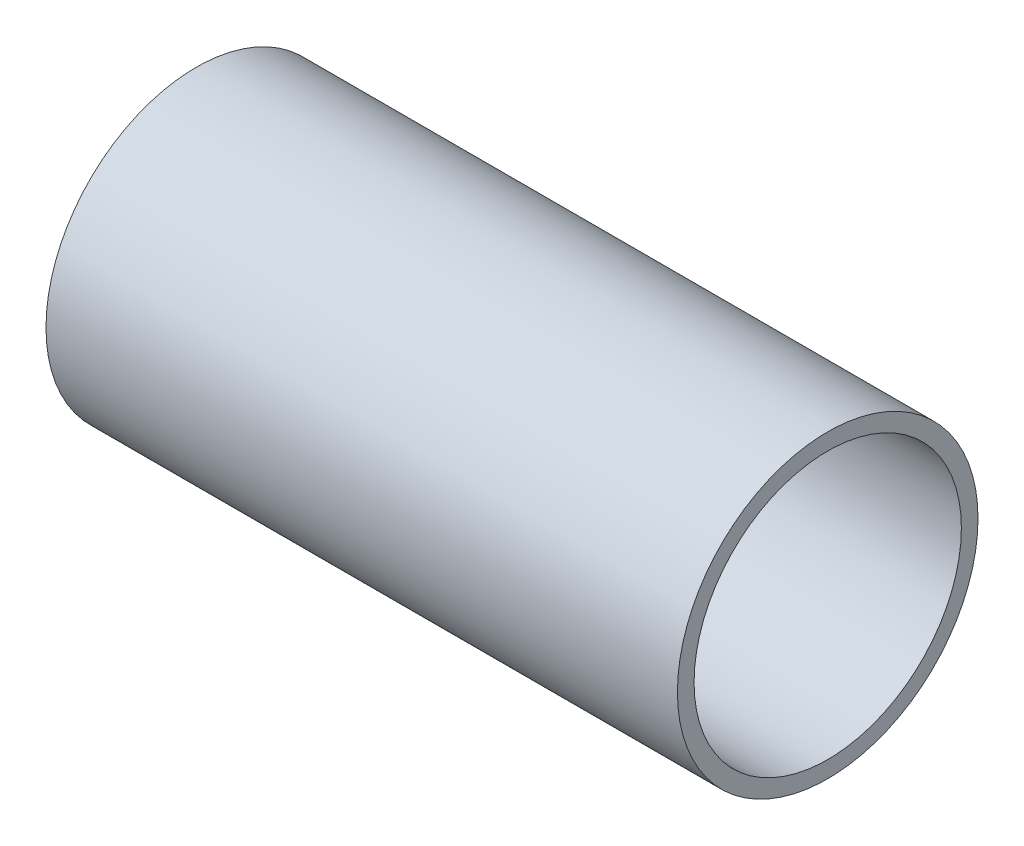
ISO-10303-21;
HEADER;
FILE_DESCRIPTION(('STEP AP214'),'2;1');
FILE_NAME('part.step','',(''),(''),'','','');
FILE_SCHEMA(('AUTOMOTIVE_DESIGN { 1 0 10303 214 1 1 1 1 }'));
ENDSEC;
DATA;
#1=APPLICATION_CONTEXT('core data for automotive mechanical design processes');
#2=APPLICATION_PROTOCOL_DEFINITION('international standard','automotive_design',2000,#1);
#3=PRODUCT_CONTEXT('',#1,'mechanical');
#4=PRODUCT('Part','Part','',(#3));
#5=PRODUCT_RELATED_PRODUCT_CATEGORY('part','',(#4));
#6=PRODUCT_DEFINITION_FORMATION('','',#4);
#7=PRODUCT_DEFINITION_CONTEXT('part definition',#1,'design');
#8=PRODUCT_DEFINITION('design','',#6,#7);
#9=PRODUCT_DEFINITION_SHAPE('','',#8);
#10=(LENGTH_UNIT() NAMED_UNIT(*) SI_UNIT(.MILLI.,.METRE.));
#11=(NAMED_UNIT(*) PLANE_ANGLE_UNIT() SI_UNIT($,.RADIAN.));
#12=(NAMED_UNIT(*) SI_UNIT($,.STERADIAN.) SOLID_ANGLE_UNIT());
#13=UNCERTAINTY_MEASURE_WITH_UNIT(LENGTH_MEASURE(1.E-05),#10,'distance_accuracy_value','');
#14=(GEOMETRIC_REPRESENTATION_CONTEXT(3) GLOBAL_UNCERTAINTY_ASSIGNED_CONTEXT((#13)) GLOBAL_UNIT_ASSIGNED_CONTEXT((#10,
#11,#12)) REPRESENTATION_CONTEXT('',''));
#15=CARTESIAN_POINT('',(0.,0.,0.));
#16=DIRECTION('',(0.,0.,1.));
#17=DIRECTION('',(1.,0.,0.));
#18=AXIS2_PLACEMENT_3D('',#15,#16,#17);
#19=CARTESIAN_POINT('',(30.,0.,0.));
#20=DIRECTION('',(1.,0.,0.));
#21=DIRECTION('',(0.,0.,-1.));
#22=AXIS2_PLACEMENT_3D('',#19,#20,#21);
#23=PLANE('',#22);
#24=CARTESIAN_POINT('',(30.,0.,0.));
#25=DIRECTION('',(1.,0.,0.));
#26=DIRECTION('',(0.,0.,-1.));
#27=AXIS2_PLACEMENT_3D('',#24,#25,#26);
#28=CIRCLE('',#27,7.14);
#29=CARTESIAN_POINT('',(30.,0.,-7.14));
#30=VERTEX_POINT('',#29);
#31=EDGE_CURVE('E10',#30,#30,#28,.T.);
#32=ORIENTED_EDGE('',*,*,#31,.T.);
#33=EDGE_LOOP('',(#32));
#34=FACE_BOUND('',#33,.T.);
#35=CARTESIAN_POINT('',(30.,0.,0.));
#36=DIRECTION('',(1.,0.,0.));
#37=DIRECTION('',(0.,0.,-1.));
#38=AXIS2_PLACEMENT_3D('',#35,#36,#37);
#39=CIRCLE('',#38,6.35);
#40=CARTESIAN_POINT('',(30.,0.,-6.35));
#41=VERTEX_POINT('',#40);
#42=EDGE_CURVE('E57',#41,#41,#39,.T.);
#43=ORIENTED_EDGE('',*,*,#42,.F.);
#44=EDGE_LOOP('',(#43));
#45=FACE_BOUND('',#44,.T.);
#46=ADVANCED_FACE('F43',(#34,#45),#23,.T.);
#47=CARTESIAN_POINT('',(0.,0.,0.));
#48=DIRECTION('',(1.,0.,0.));
#49=DIRECTION('',(0.,0.,-1.));
#50=AXIS2_PLACEMENT_3D('',#47,#48,#49);
#51=PLANE('',#50);
#52=CARTESIAN_POINT('',(0.,0.,0.));
#53=DIRECTION('',(1.,0.,0.));
#54=DIRECTION('',(0.,0.,-1.));
#55=AXIS2_PLACEMENT_3D('',#52,#53,#54);
#56=CIRCLE('',#55,7.14);
#57=CARTESIAN_POINT('',(0.,0.,-7.14));
#58=VERTEX_POINT('',#57);
#59=EDGE_CURVE('E50',#58,#58,#56,.T.);
#60=ORIENTED_EDGE('',*,*,#59,.F.);
#61=EDGE_LOOP('',(#60));
#62=FACE_BOUND('',#61,.T.);
#63=CARTESIAN_POINT('',(0.,0.,0.));
#64=DIRECTION('',(1.,0.,0.));
#65=DIRECTION('',(0.,0.,-1.));
#66=AXIS2_PLACEMENT_3D('',#63,#64,#65);
#67=CIRCLE('',#66,6.35);
#68=CARTESIAN_POINT('',(0.,0.,-6.35));
#69=VERTEX_POINT('',#68);
#70=EDGE_CURVE('E59',#69,#69,#67,.T.);
#71=ORIENTED_EDGE('',*,*,#70,.T.);
#72=EDGE_LOOP('',(#71));
#73=FACE_BOUND('',#72,.T.);
#74=ADVANCED_FACE('F69',(#62,#73),#51,.F.);
#75=CARTESIAN_POINT('',(30.,0.,0.));
#76=DIRECTION('',(-1.,0.,0.));
#77=DIRECTION('',(0.,0.,1.));
#78=AXIS2_PLACEMENT_3D('',#75,#76,#77);
#79=CYLINDRICAL_SURFACE('',#78,7.14);
#80=ORIENTED_EDGE('',*,*,#31,.F.);
#81=EDGE_LOOP('',(#80));
#82=FACE_BOUND('',#81,.T.);
#83=ORIENTED_EDGE('',*,*,#59,.T.);
#84=EDGE_LOOP('',(#83));
#85=FACE_BOUND('',#84,.T.);
#86=ADVANCED_FACE('F44',(#82,#85),#79,.T.);
#87=CARTESIAN_POINT('',(30.,0.,0.));
#88=DIRECTION('',(-1.,0.,0.));
#89=DIRECTION('',(0.,0.,1.));
#90=AXIS2_PLACEMENT_3D('',#87,#88,#89);
#91=CYLINDRICAL_SURFACE('',#90,6.35);
#92=ORIENTED_EDGE('',*,*,#42,.T.);
#93=EDGE_LOOP('',(#92));
#94=FACE_BOUND('',#93,.T.);
#95=ORIENTED_EDGE('',*,*,#70,.F.);
#96=EDGE_LOOP('',(#95));
#97=FACE_BOUND('',#96,.T.);
#98=ADVANCED_FACE('F66',(#94,#97),#91,.F.);
#99=CLOSED_SHELL('',(#46,#74,#86,#98));
#100=MANIFOLD_SOLID_BREP('B2',#99);
#101=ADVANCED_BREP_SHAPE_REPRESENTATION('',(#18,#100),#14);
#102=SHAPE_DEFINITION_REPRESENTATION(#9,#101);
ENDSEC;
END-ISO-10303-21;
